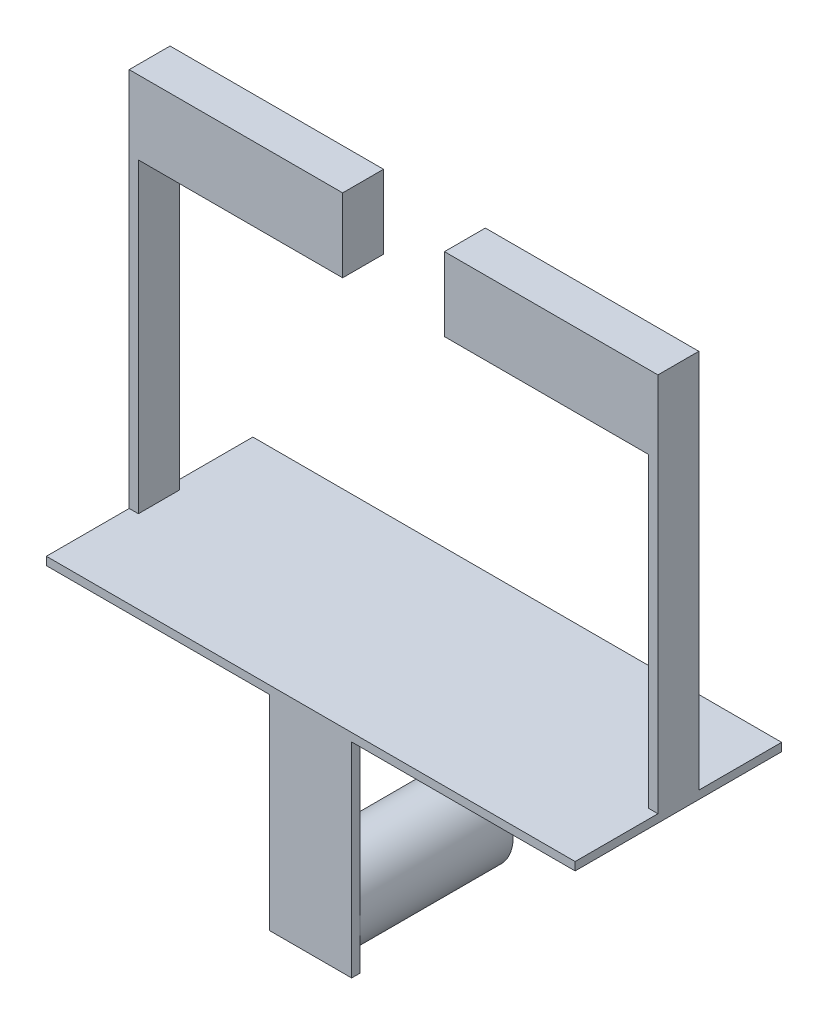
ISO-10303-21;
HEADER;
FILE_DESCRIPTION(('STEP AP214'),'2;1');
FILE_NAME('part.step','',(''),(''),'','','');
FILE_SCHEMA(('AUTOMOTIVE_DESIGN { 1 0 10303 214 1 1 1 1 }'));
ENDSEC;
DATA;
#1=APPLICATION_CONTEXT('core data for automotive mechanical design processes');
#2=APPLICATION_PROTOCOL_DEFINITION('international standard','automotive_design',2000,#1);
#3=PRODUCT_CONTEXT('',#1,'mechanical');
#4=PRODUCT('Part','Part','',(#3));
#5=PRODUCT_RELATED_PRODUCT_CATEGORY('part','',(#4));
#6=PRODUCT_DEFINITION_FORMATION('','',#4);
#7=PRODUCT_DEFINITION_CONTEXT('part definition',#1,'design');
#8=PRODUCT_DEFINITION('design','',#6,#7);
#9=PRODUCT_DEFINITION_SHAPE('','',#8);
#10=(LENGTH_UNIT() NAMED_UNIT(*) SI_UNIT(.MILLI.,.METRE.));
#11=(NAMED_UNIT(*) PLANE_ANGLE_UNIT() SI_UNIT($,.RADIAN.));
#12=(NAMED_UNIT(*) SI_UNIT($,.STERADIAN.) SOLID_ANGLE_UNIT());
#13=UNCERTAINTY_MEASURE_WITH_UNIT(LENGTH_MEASURE(1.E-05),#10,'distance_accuracy_value','');
#14=(GEOMETRIC_REPRESENTATION_CONTEXT(3) GLOBAL_UNCERTAINTY_ASSIGNED_CONTEXT((#13)) GLOBAL_UNIT_ASSIGNED_CONTEXT((#10,
#11,#12)) REPRESENTATION_CONTEXT('',''));
#15=CARTESIAN_POINT('',(0.,0.,0.));
#16=DIRECTION('',(0.,0.,1.));
#17=DIRECTION('',(1.,0.,0.));
#18=AXIS2_PLACEMENT_3D('',#15,#16,#17);
#19=CARTESIAN_POINT('',(0.,26.416,0.));
#20=DIRECTION('',(0.,-1.,0.));
#21=DIRECTION('',(0.,0.,-1.));
#22=AXIS2_PLACEMENT_3D('',#19,#20,#21);
#23=PLANE('',#22);
#24=DIRECTION('',(1.,0.,0.));
#25=VECTOR('',#24,1.);
#26=CARTESIAN_POINT('',(-44.9980277605177,26.416,-17.9190480402712));
#27=LINE('',#26,#25);
#28=CARTESIAN_POINT('',(-44.9980277605177,26.416,-17.9190480402712));
#29=VERTEX_POINT('',#28);
#30=CARTESIAN_POINT('',(-43.8550277605177,26.416,-17.9190480402712));
#31=VERTEX_POINT('',#30);
#32=EDGE_CURVE('E309',#29,#31,#27,.T.);
#33=ORIENTED_EDGE('',*,*,#32,.F.);
#34=DIRECTION('',(0.,0.,1.));
#35=VECTOR('',#34,1.);
#36=CARTESIAN_POINT('',(-44.9980277605177,26.416,-7.63204804027117));
#37=LINE('',#36,#35);
#38=CARTESIAN_POINT('',(-44.9980277605177,26.416,-7.63204804027117));
#39=VERTEX_POINT('',#38);
#40=EDGE_CURVE('E230',#29,#39,#37,.T.);
#41=ORIENTED_EDGE('',*,*,#40,.T.);
#42=DIRECTION('',(1.,0.,0.));
#43=VECTOR('',#42,1.);
#44=CARTESIAN_POINT('',(-44.9980277605177,26.416,-7.63204804027117));
#45=LINE('',#44,#43);
#46=CARTESIAN_POINT('',(20.6965322394823,26.416,-7.63204804027119));
#47=VERTEX_POINT('',#46);
#48=EDGE_CURVE('E370',#39,#47,#45,.T.);
#49=ORIENTED_EDGE('',*,*,#48,.T.);
#50=DIRECTION('',(0.,0.,-1.));
#51=VECTOR('',#50,1.);
#52=CARTESIAN_POINT('',(20.6965322394823,26.416,-7.63204804027119));
#53=LINE('',#52,#51);
#54=CARTESIAN_POINT('',(20.6965322394823,26.416,-17.9190480402712));
#55=VERTEX_POINT('',#54);
#56=EDGE_CURVE('E357',#47,#55,#53,.T.);
#57=ORIENTED_EDGE('',*,*,#56,.T.);
#58=DIRECTION('',(1.,0.,0.));
#59=VECTOR('',#58,1.);
#60=CARTESIAN_POINT('',(20.6965322394823,26.416,-17.9190480402712));
#61=LINE('',#60,#59);
#62=CARTESIAN_POINT('',(19.5414560760783,26.416,-17.9190480402712));
#63=VERTEX_POINT('',#62);
#64=EDGE_CURVE('E344',#63,#55,#61,.T.);
#65=ORIENTED_EDGE('',*,*,#64,.F.);
#66=DIRECTION('',(0.,0.,1.));
#67=VECTOR('',#66,1.);
#68=CARTESIAN_POINT('',(19.5414560760783,26.416,-22.9990480402712));
#69=LINE('',#68,#67);
#70=CARTESIAN_POINT('',(19.5414560760783,26.416,-22.9990480402712));
#71=VERTEX_POINT('',#70);
#72=EDGE_CURVE('E350',#71,#63,#69,.T.);
#73=ORIENTED_EDGE('',*,*,#72,.F.);
#74=DIRECTION('',(-1.,0.,0.));
#75=VECTOR('',#74,1.);
#76=CARTESIAN_POINT('',(20.6965322394823,26.416,-22.9990480402712));
#77=LINE('',#76,#75);
#78=CARTESIAN_POINT('',(20.6965322394823,26.416,-22.9990480402712));
#79=VERTEX_POINT('',#78);
#80=EDGE_CURVE('E312',#79,#71,#77,.T.);
#81=ORIENTED_EDGE('',*,*,#80,.F.);
#82=CARTESIAN_POINT('',(20.6965322394823,26.416,-33.2860480402712));
#83=VERTEX_POINT('',#82);
#84=EDGE_CURVE('E363',#79,#83,#53,.T.);
#85=ORIENTED_EDGE('',*,*,#84,.T.);
#86=DIRECTION('',(-1.,0.,0.));
#87=VECTOR('',#86,1.);
#88=CARTESIAN_POINT('',(-44.9980277605177,26.416,-33.2860480402712));
#89=LINE('',#88,#87);
#90=CARTESIAN_POINT('',(-44.9980277605177,26.416,-33.2860480402712));
#91=VERTEX_POINT('',#90);
#92=EDGE_CURVE('E359',#83,#91,#89,.T.);
#93=ORIENTED_EDGE('',*,*,#92,.T.);
#94=CARTESIAN_POINT('',(-44.9980277605177,26.416,-22.9990480402712));
#95=VERTEX_POINT('',#94);
#96=EDGE_CURVE('E364',#91,#95,#37,.T.);
#97=ORIENTED_EDGE('',*,*,#96,.T.);
#98=DIRECTION('',(-1.,0.,0.));
#99=VECTOR('',#98,1.);
#100=CARTESIAN_POINT('',(-44.9980277605177,26.416,-22.9990480402712));
#101=LINE('',#100,#99);
#102=CARTESIAN_POINT('',(-43.8550277605177,26.416,-22.9990480402712));
#103=VERTEX_POINT('',#102);
#104=EDGE_CURVE('E95',#103,#95,#101,.T.);
#105=ORIENTED_EDGE('',*,*,#104,.F.);
#106=DIRECTION('',(0.,0.,-1.));
#107=VECTOR('',#106,1.);
#108=CARTESIAN_POINT('',(-43.8550277605177,26.416,-17.9190480402712));
#109=LINE('',#108,#107);
#110=EDGE_CURVE('E86',#31,#103,#109,.T.);
#111=ORIENTED_EDGE('',*,*,#110,.F.);
#112=EDGE_LOOP('',(#33,#41,#49,#57,#65,#73,#81,#85,#93,#97,#105,#111));
#113=FACE_BOUND('',#112,.T.);
#114=ADVANCED_FACE('F69',(#113),#23,.F.);
#115=CARTESIAN_POINT('',(-17.2688477605177,25.4,-8.64804804027118));
#116=DIRECTION('',(0.,0.,1.));
#117=DIRECTION('',(1.,0.,0.));
#118=AXIS2_PLACEMENT_3D('',#115,#116,#117);
#119=PLANE('',#118);
#120=DIRECTION('',(0.,-1.,0.));
#121=VECTOR('',#120,1.);
#122=CARTESIAN_POINT('',(-17.2688477605177,25.4,-8.64804804027118));
#123=LINE('',#122,#121);
#124=CARTESIAN_POINT('',(-17.2688477605177,5.098542,-8.64804804027118));
#125=VERTEX_POINT('',#124);
#126=CARTESIAN_POINT('',(-17.2688477605177,0.,-8.64804804027118));
#127=VERTEX_POINT('',#126);
#128=EDGE_CURVE('E438',#125,#127,#123,.T.);
#129=ORIENTED_EDGE('',*,*,#128,.F.);
#130=CARTESIAN_POINT('',(-12.1697977605177,5.098542,-8.64804804027118));
#131=DIRECTION('',(0.,0.,1.));
#132=DIRECTION('',(1.,0.,0.));
#133=AXIS2_PLACEMENT_3D('',#130,#131,#132);
#134=CIRCLE('',#133,5.09905);
#135=CARTESIAN_POINT('',(-12.241772594564,0.,-8.64804804027118));
#136=VERTEX_POINT('',#135);
#137=EDGE_CURVE('E12',#125,#136,#134,.T.);
#138=ORIENTED_EDGE('',*,*,#137,.T.);
#139=DIRECTION('',(-1.,0.,0.));
#140=VECTOR('',#139,1.);
#141=CARTESIAN_POINT('',(-17.2688477605177,0.,-8.64804804027118));
#142=LINE('',#141,#140);
#143=EDGE_CURVE('E73',#136,#127,#142,.T.);
#144=ORIENTED_EDGE('',*,*,#143,.T.);
#145=EDGE_LOOP('',(#129,#138,#144));
#146=FACE_BOUND('',#145,.T.);
#147=ADVANCED_FACE('F507',(#146),#119,.F.);
#148=DIRECTION('',(0.,-1.,0.));
#149=VECTOR('',#148,1.);
#150=CARTESIAN_POINT('',(-7.0707477605177,25.4,-8.64804804027118));
#151=LINE('',#150,#149);
#152=CARTESIAN_POINT('',(-7.0707477605177,25.4,-8.64804804027118));
#153=VERTEX_POINT('',#152);
#154=CARTESIAN_POINT('',(-7.0707477605177,5.098542,-8.64804804027118));
#155=VERTEX_POINT('',#154);
#156=EDGE_CURVE('E437',#153,#155,#151,.T.);
#157=ORIENTED_EDGE('',*,*,#156,.T.);
#158=EDGE_CURVE('E397',#155,#125,#134,.T.);
#159=ORIENTED_EDGE('',*,*,#158,.T.);
#160=CARTESIAN_POINT('',(-17.2688477605177,25.4,-8.64804804027118));
#161=VERTEX_POINT('',#160);
#162=EDGE_CURVE('E435',#161,#125,#123,.T.);
#163=ORIENTED_EDGE('',*,*,#162,.F.);
#164=DIRECTION('',(-1.,0.,0.));
#165=VECTOR('',#164,1.);
#166=CARTESIAN_POINT('',(-17.2688477605177,25.4,-8.64804804027118));
#167=LINE('',#166,#165);
#168=EDGE_CURVE('E476',#153,#161,#167,.T.);
#169=ORIENTED_EDGE('',*,*,#168,.F.);
#170=EDGE_LOOP('',(#157,#159,#163,#169));
#171=FACE_BOUND('',#170,.T.);
#172=ADVANCED_FACE('F508',(#171),#119,.F.);
#173=CARTESIAN_POINT('',(-17.2688477605177,25.4,-8.64804804027118));
#174=DIRECTION('',(1.,0.,0.));
#175=DIRECTION('',(0.,0.,-1.));
#176=AXIS2_PLACEMENT_3D('',#173,#174,#175);
#177=PLANE('',#176);
#178=DIRECTION('',(0.,0.,1.));
#179=VECTOR('',#178,1.);
#180=CARTESIAN_POINT('',(-17.2688477605177,0.,-8.64804804027118));
#181=LINE('',#180,#179);
#182=CARTESIAN_POINT('',(-17.2688477605177,0.,-7.63204804027118));
#183=VERTEX_POINT('',#182);
#184=EDGE_CURVE('E403',#127,#183,#181,.T.);
#185=ORIENTED_EDGE('',*,*,#184,.T.);
#186=DIRECTION('',(0.,-1.,0.));
#187=VECTOR('',#186,1.);
#188=CARTESIAN_POINT('',(-17.2688477605177,25.4,-7.63204804027118));
#189=LINE('',#188,#187);
#190=CARTESIAN_POINT('',(-17.2688477605177,25.4,-7.63204804027118));
#191=VERTEX_POINT('',#190);
#192=EDGE_CURVE('E416',#191,#183,#189,.T.);
#193=ORIENTED_EDGE('',*,*,#192,.F.);
#194=DIRECTION('',(0.,0.,1.));
#195=VECTOR('',#194,1.);
#196=CARTESIAN_POINT('',(-17.2688477605177,25.4,-8.64804804027118));
#197=LINE('',#196,#195);
#198=EDGE_CURVE('E424',#161,#191,#197,.T.);
#199=ORIENTED_EDGE('',*,*,#198,.F.);
#200=ORIENTED_EDGE('',*,*,#162,.T.);
#201=ORIENTED_EDGE('',*,*,#128,.T.);
#202=EDGE_LOOP('',(#185,#193,#199,#200,#201));
#203=FACE_BOUND('',#202,.T.);
#204=ADVANCED_FACE('F71',(#203),#177,.F.);
#205=CARTESIAN_POINT('',(-17.2688477605177,25.4,-7.63204804027118));
#206=DIRECTION('',(0.,0.,-1.));
#207=DIRECTION('',(-1.,0.,0.));
#208=AXIS2_PLACEMENT_3D('',#205,#206,#207);
#209=PLANE('',#208);
#210=DIRECTION('',(1.,0.,0.));
#211=VECTOR('',#210,1.);
#212=CARTESIAN_POINT('',(-17.2688477605177,0.,-7.63204804027118));
#213=LINE('',#212,#211);
#214=CARTESIAN_POINT('',(-7.0707477605177,0.,-7.63204804027118));
#215=VERTEX_POINT('',#214);
#216=EDGE_CURVE('E466',#183,#215,#213,.T.);
#217=ORIENTED_EDGE('',*,*,#216,.T.);
#218=DIRECTION('',(0.,-1.,0.));
#219=VECTOR('',#218,1.);
#220=CARTESIAN_POINT('',(-7.0707477605177,25.4,-7.63204804027118));
#221=LINE('',#220,#219);
#222=CARTESIAN_POINT('',(-7.0707477605177,25.4,-7.63204804027118));
#223=VERTEX_POINT('',#222);
#224=EDGE_CURVE('E442',#223,#215,#221,.T.);
#225=ORIENTED_EDGE('',*,*,#224,.F.);
#226=DIRECTION('',(1.,0.,0.));
#227=VECTOR('',#226,1.);
#228=CARTESIAN_POINT('',(-44.9980277605177,25.4,-7.63204804027117));
#229=LINE('',#228,#227);
#230=CARTESIAN_POINT('',(20.6965322394823,25.4,-7.63204804027119));
#231=VERTEX_POINT('',#230);
#232=EDGE_CURVE('E379',#223,#231,#229,.T.);
#233=ORIENTED_EDGE('',*,*,#232,.T.);
#234=DIRECTION('',(0.,-1.,0.));
#235=VECTOR('',#234,1.);
#236=CARTESIAN_POINT('',(20.6965322394823,26.416,-7.63204804027119));
#237=LINE('',#236,#235);
#238=EDGE_CURVE('E369',#47,#231,#237,.T.);
#239=ORIENTED_EDGE('',*,*,#238,.F.);
#240=ORIENTED_EDGE('',*,*,#48,.F.);
#241=DIRECTION('',(0.,-1.,0.));
#242=VECTOR('',#241,1.);
#243=CARTESIAN_POINT('',(-44.9980277605177,26.416,-7.63204804027117));
#244=LINE('',#243,#242);
#245=CARTESIAN_POINT('',(-44.9980277605177,25.4,-7.63204804027117));
#246=VERTEX_POINT('',#245);
#247=EDGE_CURVE('E389',#39,#246,#244,.T.);
#248=ORIENTED_EDGE('',*,*,#247,.T.);
#249=EDGE_CURVE('E382',#246,#191,#229,.T.);
#250=ORIENTED_EDGE('',*,*,#249,.T.);
#251=ORIENTED_EDGE('',*,*,#192,.T.);
#252=EDGE_LOOP('',(#217,#225,#233,#239,#240,#248,#250,#251));
#253=FACE_BOUND('',#252,.T.);
#254=ADVANCED_FACE('F512',(#253),#209,.F.);
#255=CARTESIAN_POINT('',(-7.0707477605177,25.4,-8.64804804027118));
#256=DIRECTION('',(-1.,0.,0.));
#257=DIRECTION('',(0.,0.,1.));
#258=AXIS2_PLACEMENT_3D('',#255,#256,#257);
#259=PLANE('',#258);
#260=DIRECTION('',(0.,0.,-1.));
#261=VECTOR('',#260,1.);
#262=CARTESIAN_POINT('',(-7.0707477605177,0.,-8.64804804027118));
#263=LINE('',#262,#261);
#264=CARTESIAN_POINT('',(-7.0707477605177,0.,-8.64804804027118));
#265=VERTEX_POINT('',#264);
#266=EDGE_CURVE('E427',#215,#265,#263,.T.);
#267=ORIENTED_EDGE('',*,*,#266,.T.);
#268=EDGE_CURVE('E440',#155,#265,#151,.T.);
#269=ORIENTED_EDGE('',*,*,#268,.F.);
#270=ORIENTED_EDGE('',*,*,#156,.F.);
#271=DIRECTION('',(0.,0.,-1.));
#272=VECTOR('',#271,1.);
#273=CARTESIAN_POINT('',(-7.0707477605177,25.4,-8.64804804027118));
#274=LINE('',#273,#272);
#275=EDGE_CURVE('E481',#223,#153,#274,.T.);
#276=ORIENTED_EDGE('',*,*,#275,.F.);
#277=ORIENTED_EDGE('',*,*,#224,.T.);
#278=EDGE_LOOP('',(#267,#269,#270,#276,#277));
#279=FACE_BOUND('',#278,.T.);
#280=ADVANCED_FACE('F462',(#279),#259,.F.);
#281=CARTESIAN_POINT('',(-12.0978229264714,0.,-8.64804804027118));
#282=VERTEX_POINT('',#281);
#283=EDGE_CURVE('E422',#265,#282,#142,.T.);
#284=ORIENTED_EDGE('',*,*,#283,.T.);
#285=EDGE_CURVE('E81',#282,#155,#134,.T.);
#286=ORIENTED_EDGE('',*,*,#285,.T.);
#287=ORIENTED_EDGE('',*,*,#268,.T.);
#288=EDGE_LOOP('',(#284,#286,#287));
#289=FACE_BOUND('',#288,.T.);
#290=ADVANCED_FACE('F459',(#289),#119,.F.);
#291=CARTESIAN_POINT('',(0.,0.,0.));
#292=DIRECTION('',(0.,1.,0.));
#293=DIRECTION('',(0.,0.,1.));
#294=AXIS2_PLACEMENT_3D('',#291,#292,#293);
#295=PLANE('',#294);
#296=ORIENTED_EDGE('',*,*,#184,.F.);
#297=ORIENTED_EDGE('',*,*,#143,.F.);
#298=CARTESIAN_POINT('',(-12.1697977605177,5.098542,-8.64804804027119));
#299=DIRECTION('',(0.,0.,-1.));
#300=DIRECTION('',(0.0141153418864927,-0.999900373599004,0.));
#301=AXIS2_PLACEMENT_3D('',#298,#299,#300);
#302=CIRCLE('',#301,5.09905);
#303=EDGE_CURVE('E428',#282,#136,#302,.T.);
#304=ORIENTED_EDGE('',*,*,#303,.F.);
#305=ORIENTED_EDGE('',*,*,#283,.F.);
#306=ORIENTED_EDGE('',*,*,#266,.F.);
#307=ORIENTED_EDGE('',*,*,#216,.F.);
#308=EDGE_LOOP('',(#296,#297,#304,#305,#306,#307));
#309=FACE_BOUND('',#308,.T.);
#310=ADVANCED_FACE('F453',(#309),#295,.F.);
#311=CARTESIAN_POINT('',(-12.1697977605177,5.098542,-27.6980480402712));
#312=DIRECTION('',(0.,0.,1.));
#313=DIRECTION('',(1.,0.,0.));
#314=AXIS2_PLACEMENT_3D('',#311,#312,#313);
#315=CYLINDRICAL_SURFACE('',#314,5.09905);
#316=CARTESIAN_POINT('',(-12.1697977605177,5.098542,-27.6980480402712));
#317=DIRECTION('',(0.,0.,1.));
#318=DIRECTION('',(1.,0.,0.));
#319=AXIS2_PLACEMENT_3D('',#316,#317,#318);
#320=CIRCLE('',#319,5.09905);
#321=CARTESIAN_POINT('',(-7.0707477605177,5.098542,-27.6980480402712));
#322=VERTEX_POINT('',#321);
#323=EDGE_CURVE('E402',#322,#322,#320,.T.);
#324=ORIENTED_EDGE('',*,*,#323,.T.);
#325=EDGE_LOOP('',(#324));
#326=FACE_BOUND('',#325,.T.);
#327=ORIENTED_EDGE('',*,*,#158,.F.);
#328=ORIENTED_EDGE('',*,*,#285,.F.);
#329=ORIENTED_EDGE('',*,*,#303,.T.);
#330=ORIENTED_EDGE('',*,*,#137,.F.);
#331=EDGE_LOOP('',(#327,#328,#329,#330));
#332=FACE_BOUND('',#331,.T.);
#333=ADVANCED_FACE('F493',(#326,#332),#315,.T.);
#334=CARTESIAN_POINT('',(-12.1697977605177,5.098542,-27.6980480402712));
#335=DIRECTION('',(0.,0.,1.));
#336=DIRECTION('',(1.,0.,0.));
#337=AXIS2_PLACEMENT_3D('',#334,#335,#336);
#338=PLANE('',#337);
#339=ORIENTED_EDGE('',*,*,#323,.F.);
#340=EDGE_LOOP('',(#339));
#341=FACE_BOUND('',#340,.T.);
#342=ADVANCED_FACE('F499',(#341),#338,.F.);
#343=CARTESIAN_POINT('',(20.6965322394823,26.416,-7.63204804027119));
#344=DIRECTION('',(-1.,0.,0.));
#345=DIRECTION('',(0.,0.,1.));
#346=AXIS2_PLACEMENT_3D('',#343,#344,#345);
#347=PLANE('',#346);
#348=DIRECTION('',(0.,0.,-1.));
#349=VECTOR('',#348,1.);
#350=CARTESIAN_POINT('',(20.6965322394823,25.4,-7.63204804027119));
#351=LINE('',#350,#349);
#352=CARTESIAN_POINT('',(20.6965322394823,25.4,-33.2860480402712));
#353=VERTEX_POINT('',#352);
#354=EDGE_CURVE('E328',#231,#353,#351,.T.);
#355=ORIENTED_EDGE('',*,*,#354,.T.);
#356=DIRECTION('',(0.,-1.,0.));
#357=VECTOR('',#356,1.);
#358=CARTESIAN_POINT('',(20.6965322394823,26.416,-33.2860480402712));
#359=LINE('',#358,#357);
#360=EDGE_CURVE('E399',#83,#353,#359,.T.);
#361=ORIENTED_EDGE('',*,*,#360,.F.);
#362=ORIENTED_EDGE('',*,*,#84,.F.);
#363=DIRECTION('',(0.,-1.,0.));
#364=VECTOR('',#363,1.);
#365=CARTESIAN_POINT('',(20.6965322394823,64.4906,-22.9990480402712));
#366=LINE('',#365,#364);
#367=CARTESIAN_POINT('',(20.6965322394823,73.6346,-22.9990480402712));
#368=VERTEX_POINT('',#367);
#369=EDGE_CURVE('E274',#368,#79,#366,.T.);
#370=ORIENTED_EDGE('',*,*,#369,.F.);
#371=DIRECTION('',(0.,0.,-1.));
#372=VECTOR('',#371,1.);
#373=CARTESIAN_POINT('',(20.6965322394823,73.6346,-17.9190480402712));
#374=LINE('',#373,#372);
#375=CARTESIAN_POINT('',(20.6965322394823,73.6346,-17.9190480402712));
#376=VERTEX_POINT('',#375);
#377=EDGE_CURVE('E288',#376,#368,#374,.T.);
#378=ORIENTED_EDGE('',*,*,#377,.F.);
#379=DIRECTION('',(0.,-1.,0.));
#380=VECTOR('',#379,1.);
#381=CARTESIAN_POINT('',(20.6965322394823,64.4906,-17.9190480402712));
#382=LINE('',#381,#380);
#383=EDGE_CURVE('E336',#376,#55,#382,.T.);
#384=ORIENTED_EDGE('',*,*,#383,.T.);
#385=ORIENTED_EDGE('',*,*,#56,.F.);
#386=ORIENTED_EDGE('',*,*,#238,.T.);
#387=EDGE_LOOP('',(#355,#361,#362,#370,#378,#384,#385,#386));
#388=FACE_BOUND('',#387,.T.);
#389=ADVANCED_FACE('F537',(#388),#347,.F.);
#390=CARTESIAN_POINT('',(-44.9980277605177,26.416,-33.2860480402712));
#391=DIRECTION('',(0.,0.,1.));
#392=DIRECTION('',(1.,0.,0.));
#393=AXIS2_PLACEMENT_3D('',#390,#391,#392);
#394=PLANE('',#393);
#395=DIRECTION('',(-1.,0.,0.));
#396=VECTOR('',#395,1.);
#397=CARTESIAN_POINT('',(-44.9980277605177,25.4,-33.2860480402712));
#398=LINE('',#397,#396);
#399=CARTESIAN_POINT('',(-44.9980277605177,25.4,-33.2860480402712));
#400=VERTEX_POINT('',#399);
#401=EDGE_CURVE('E372',#353,#400,#398,.T.);
#402=ORIENTED_EDGE('',*,*,#401,.T.);
#403=DIRECTION('',(0.,-1.,0.));
#404=VECTOR('',#403,1.);
#405=CARTESIAN_POINT('',(-44.9980277605177,26.416,-33.2860480402712));
#406=LINE('',#405,#404);
#407=EDGE_CURVE('E395',#91,#400,#406,.T.);
#408=ORIENTED_EDGE('',*,*,#407,.F.);
#409=ORIENTED_EDGE('',*,*,#92,.F.);
#410=ORIENTED_EDGE('',*,*,#360,.T.);
#411=EDGE_LOOP('',(#402,#408,#409,#410));
#412=FACE_BOUND('',#411,.T.);
#413=ADVANCED_FACE('F533',(#412),#394,.F.);
#414=CARTESIAN_POINT('',(-44.9980277605177,26.416,-7.63204804027117));
#415=DIRECTION('',(1.,0.,0.));
#416=DIRECTION('',(0.,0.,-1.));
#417=AXIS2_PLACEMENT_3D('',#414,#415,#416);
#418=PLANE('',#417);
#419=DIRECTION('',(0.,0.,1.));
#420=VECTOR('',#419,1.);
#421=CARTESIAN_POINT('',(-44.9980277605177,25.4,-7.63204804027117));
#422=LINE('',#421,#420);
#423=EDGE_CURVE('E380',#400,#246,#422,.T.);
#424=ORIENTED_EDGE('',*,*,#423,.T.);
#425=ORIENTED_EDGE('',*,*,#247,.F.);
#426=ORIENTED_EDGE('',*,*,#40,.F.);
#427=DIRECTION('',(0.,-1.,0.));
#428=VECTOR('',#427,1.);
#429=CARTESIAN_POINT('',(-44.9980277605177,64.4906,-17.9190480402712));
#430=LINE('',#429,#428);
#431=CARTESIAN_POINT('',(-44.9980277605177,73.6346,-17.9190480402712));
#432=VERTEX_POINT('',#431);
#433=EDGE_CURVE('E221',#432,#29,#430,.T.);
#434=ORIENTED_EDGE('',*,*,#433,.F.);
#435=DIRECTION('',(0.,0.,1.));
#436=VECTOR('',#435,1.);
#437=CARTESIAN_POINT('',(-44.9980277605177,73.6346,-22.9990480402712));
#438=LINE('',#437,#436);
#439=CARTESIAN_POINT('',(-44.9980277605177,73.6346,-22.9990480402712));
#440=VERTEX_POINT('',#439);
#441=EDGE_CURVE('E227',#440,#432,#438,.T.);
#442=ORIENTED_EDGE('',*,*,#441,.F.);
#443=DIRECTION('',(0.,-1.,0.));
#444=VECTOR('',#443,1.);
#445=CARTESIAN_POINT('',(-44.9980277605177,64.4906,-22.9990480402712));
#446=LINE('',#445,#444);
#447=EDGE_CURVE('E235',#440,#95,#446,.T.);
#448=ORIENTED_EDGE('',*,*,#447,.T.);
#449=ORIENTED_EDGE('',*,*,#96,.F.);
#450=ORIENTED_EDGE('',*,*,#407,.T.);
#451=EDGE_LOOP('',(#424,#425,#426,#434,#442,#448,#449,#450));
#452=FACE_BOUND('',#451,.T.);
#453=ADVANCED_FACE('F223',(#452),#418,.F.);
#454=CARTESIAN_POINT('',(0.,25.4,0.));
#455=DIRECTION('',(0.,-1.,0.));
#456=DIRECTION('',(0.,0.,-1.));
#457=AXIS2_PLACEMENT_3D('',#454,#455,#456);
#458=PLANE('',#457);
#459=ORIENTED_EDGE('',*,*,#168,.T.);
#460=ORIENTED_EDGE('',*,*,#198,.T.);
#461=ORIENTED_EDGE('',*,*,#249,.F.);
#462=ORIENTED_EDGE('',*,*,#423,.F.);
#463=ORIENTED_EDGE('',*,*,#401,.F.);
#464=ORIENTED_EDGE('',*,*,#354,.F.);
#465=ORIENTED_EDGE('',*,*,#232,.F.);
#466=ORIENTED_EDGE('',*,*,#275,.T.);
#467=EDGE_LOOP('',(#459,#460,#461,#462,#463,#464,#465,#466));
#468=FACE_BOUND('',#467,.T.);
#469=ADVANCED_FACE('F528',(#468),#458,.T.);
#470=CARTESIAN_POINT('',(20.6965322394823,64.4906,-22.9990480402712));
#471=DIRECTION('',(0.,0.,1.));
#472=DIRECTION('',(1.,0.,0.));
#473=AXIS2_PLACEMENT_3D('',#470,#471,#472);
#474=PLANE('',#473);
#475=ORIENTED_EDGE('',*,*,#80,.T.);
#476=DIRECTION('',(0.,-1.,0.));
#477=VECTOR('',#476,1.);
#478=CARTESIAN_POINT('',(19.5414560760783,64.4906,-22.9990480402712));
#479=LINE('',#478,#477);
#480=CARTESIAN_POINT('',(19.5414560760783,64.4906,-22.9990480402712));
#481=VERTEX_POINT('',#480);
#482=EDGE_CURVE('E329',#481,#71,#479,.T.);
#483=ORIENTED_EDGE('',*,*,#482,.F.);
#484=DIRECTION('',(-1.,0.,0.));
#485=VECTOR('',#484,1.);
#486=CARTESIAN_POINT('',(20.6965322394823,64.4906,-22.9990480402712));
#487=LINE('',#486,#485);
#488=CARTESIAN_POINT('',(-5.8261477605177,64.4906,-22.9990480402712));
#489=VERTEX_POINT('',#488);
#490=EDGE_CURVE('E269',#481,#489,#487,.T.);
#491=ORIENTED_EDGE('',*,*,#490,.T.);
#492=DIRECTION('',(0.,-1.,0.));
#493=VECTOR('',#492,1.);
#494=CARTESIAN_POINT('',(-5.8261477605177,73.6346,-22.9990480402712));
#495=LINE('',#494,#493);
#496=CARTESIAN_POINT('',(-5.8261477605177,73.6346,-22.9990480402712));
#497=VERTEX_POINT('',#496);
#498=EDGE_CURVE('E273',#497,#489,#495,.T.);
#499=ORIENTED_EDGE('',*,*,#498,.F.);
#500=DIRECTION('',(-1.,0.,0.));
#501=VECTOR('',#500,1.);
#502=CARTESIAN_POINT('',(20.6965322394823,73.6346,-22.9990480402712));
#503=LINE('',#502,#501);
#504=EDGE_CURVE('E297',#368,#497,#503,.T.);
#505=ORIENTED_EDGE('',*,*,#504,.F.);
#506=ORIENTED_EDGE('',*,*,#369,.T.);
#507=EDGE_LOOP('',(#475,#483,#491,#499,#505,#506));
#508=FACE_BOUND('',#507,.T.);
#509=ADVANCED_FACE('F532',(#508),#474,.F.);
#510=CARTESIAN_POINT('',(19.5414560760783,64.4906,-22.9990480402712));
#511=DIRECTION('',(1.,0.,0.));
#512=DIRECTION('',(0.,0.,-1.));
#513=AXIS2_PLACEMENT_3D('',#510,#511,#512);
#514=PLANE('',#513);
#515=ORIENTED_EDGE('',*,*,#72,.T.);
#516=DIRECTION('',(0.,-1.,0.));
#517=VECTOR('',#516,1.);
#518=CARTESIAN_POINT('',(19.5414560760783,64.4906,-17.9190480402712));
#519=LINE('',#518,#517);
#520=CARTESIAN_POINT('',(19.5414560760783,64.4906,-17.9190480402712));
#521=VERTEX_POINT('',#520);
#522=EDGE_CURVE('E333',#521,#63,#519,.T.);
#523=ORIENTED_EDGE('',*,*,#522,.F.);
#524=DIRECTION('',(0.,0.,1.));
#525=VECTOR('',#524,1.);
#526=CARTESIAN_POINT('',(19.5414560760783,64.4906,-22.9990480402712));
#527=LINE('',#526,#525);
#528=EDGE_CURVE('E342',#481,#521,#527,.T.);
#529=ORIENTED_EDGE('',*,*,#528,.F.);
#530=ORIENTED_EDGE('',*,*,#482,.T.);
#531=EDGE_LOOP('',(#515,#523,#529,#530));
#532=FACE_BOUND('',#531,.T.);
#533=ADVANCED_FACE('F778',(#532),#514,.F.);
#534=CARTESIAN_POINT('',(20.6965322394823,64.4906,-17.9190480402712));
#535=DIRECTION('',(0.,0.,-1.));
#536=DIRECTION('',(-1.,0.,0.));
#537=AXIS2_PLACEMENT_3D('',#534,#535,#536);
#538=PLANE('',#537);
#539=ORIENTED_EDGE('',*,*,#64,.T.);
#540=ORIENTED_EDGE('',*,*,#383,.F.);
#541=DIRECTION('',(1.,0.,0.));
#542=VECTOR('',#541,1.);
#543=CARTESIAN_POINT('',(20.6965322394823,73.6346,-17.9190480402712));
#544=LINE('',#543,#542);
#545=CARTESIAN_POINT('',(-5.8261477605177,73.6346,-17.9190480402712));
#546=VERTEX_POINT('',#545);
#547=EDGE_CURVE('E281',#546,#376,#544,.T.);
#548=ORIENTED_EDGE('',*,*,#547,.F.);
#549=DIRECTION('',(0.,-1.,0.));
#550=VECTOR('',#549,1.);
#551=CARTESIAN_POINT('',(-5.8261477605177,73.6346,-17.9190480402712));
#552=LINE('',#551,#550);
#553=CARTESIAN_POINT('',(-5.8261477605177,64.4906,-17.9190480402712));
#554=VERTEX_POINT('',#553);
#555=EDGE_CURVE('E278',#546,#554,#552,.T.);
#556=ORIENTED_EDGE('',*,*,#555,.T.);
#557=DIRECTION('',(1.,0.,0.));
#558=VECTOR('',#557,1.);
#559=CARTESIAN_POINT('',(20.6965322394823,64.4906,-17.9190480402712));
#560=LINE('',#559,#558);
#561=EDGE_CURVE('E282',#554,#521,#560,.T.);
#562=ORIENTED_EDGE('',*,*,#561,.T.);
#563=ORIENTED_EDGE('',*,*,#522,.T.);
#564=EDGE_LOOP('',(#539,#540,#548,#556,#562,#563));
#565=FACE_BOUND('',#564,.T.);
#566=ADVANCED_FACE('F526',(#565),#538,.F.);
#567=CARTESIAN_POINT('',(-43.8550277605177,64.4906,-17.9190480402712));
#568=DIRECTION('',(-1.,0.,0.));
#569=DIRECTION('',(0.,0.,1.));
#570=AXIS2_PLACEMENT_3D('',#567,#568,#569);
#571=PLANE('',#570);
#572=ORIENTED_EDGE('',*,*,#110,.T.);
#573=DIRECTION('',(0.,-1.,0.));
#574=VECTOR('',#573,1.);
#575=CARTESIAN_POINT('',(-43.8550277605177,64.4906,-22.9990480402712));
#576=LINE('',#575,#574);
#577=CARTESIAN_POINT('',(-43.8550277605177,64.4906,-22.9990480402712));
#578=VERTEX_POINT('',#577);
#579=EDGE_CURVE('E324',#578,#103,#576,.T.);
#580=ORIENTED_EDGE('',*,*,#579,.F.);
#581=DIRECTION('',(0.,0.,-1.));
#582=VECTOR('',#581,1.);
#583=CARTESIAN_POINT('',(-43.8550277605177,64.4906,-17.9190480402712));
#584=LINE('',#583,#582);
#585=CARTESIAN_POINT('',(-43.8550277605177,64.4906,-17.9190480402712));
#586=VERTEX_POINT('',#585);
#587=EDGE_CURVE('E306',#586,#578,#584,.T.);
#588=ORIENTED_EDGE('',*,*,#587,.F.);
#589=DIRECTION('',(0.,-1.,0.));
#590=VECTOR('',#589,1.);
#591=CARTESIAN_POINT('',(-43.8550277605177,64.4906,-17.9190480402712));
#592=LINE('',#591,#590);
#593=EDGE_CURVE('E231',#586,#31,#592,.T.);
#594=ORIENTED_EDGE('',*,*,#593,.T.);
#595=EDGE_LOOP('',(#572,#580,#588,#594));
#596=FACE_BOUND('',#595,.T.);
#597=ADVANCED_FACE('F796',(#596),#571,.F.);
#598=CARTESIAN_POINT('',(-44.9980277605177,64.4906,-22.9990480402712));
#599=DIRECTION('',(0.,0.,1.));
#600=DIRECTION('',(1.,0.,0.));
#601=AXIS2_PLACEMENT_3D('',#598,#599,#600);
#602=PLANE('',#601);
#603=ORIENTED_EDGE('',*,*,#104,.T.);
#604=ORIENTED_EDGE('',*,*,#447,.F.);
#605=DIRECTION('',(-1.,0.,0.));
#606=VECTOR('',#605,1.);
#607=CARTESIAN_POINT('',(-44.9980277605177,73.6346,-22.9990480402712));
#608=LINE('',#607,#606);
#609=CARTESIAN_POINT('',(-18.4753477605177,73.6346,-22.9990480402712));
#610=VERTEX_POINT('',#609);
#611=EDGE_CURVE('E247',#610,#440,#608,.T.);
#612=ORIENTED_EDGE('',*,*,#611,.F.);
#613=DIRECTION('',(0.,-1.,0.));
#614=VECTOR('',#613,1.);
#615=CARTESIAN_POINT('',(-18.4753477605177,73.6346,-22.9990480402712));
#616=LINE('',#615,#614);
#617=CARTESIAN_POINT('',(-18.4753477605177,64.4906,-22.9990480402712));
#618=VERTEX_POINT('',#617);
#619=EDGE_CURVE('E265',#610,#618,#616,.T.);
#620=ORIENTED_EDGE('',*,*,#619,.T.);
#621=DIRECTION('',(-1.,0.,0.));
#622=VECTOR('',#621,1.);
#623=CARTESIAN_POINT('',(-44.9980277605177,64.4906,-22.9990480402712));
#624=LINE('',#623,#622);
#625=EDGE_CURVE('E249',#618,#578,#624,.T.);
#626=ORIENTED_EDGE('',*,*,#625,.T.);
#627=ORIENTED_EDGE('',*,*,#579,.T.);
#628=EDGE_LOOP('',(#603,#604,#612,#620,#626,#627));
#629=FACE_BOUND('',#628,.T.);
#630=ADVANCED_FACE('F804',(#629),#602,.F.);
#631=CARTESIAN_POINT('',(-44.9980277605177,64.4906,-17.9190480402712));
#632=DIRECTION('',(0.,0.,-1.));
#633=DIRECTION('',(-1.,0.,0.));
#634=AXIS2_PLACEMENT_3D('',#631,#632,#633);
#635=PLANE('',#634);
#636=ORIENTED_EDGE('',*,*,#32,.T.);
#637=ORIENTED_EDGE('',*,*,#593,.F.);
#638=DIRECTION('',(1.,0.,0.));
#639=VECTOR('',#638,1.);
#640=CARTESIAN_POINT('',(-44.9980277605177,64.4906,-17.9190480402712));
#641=LINE('',#640,#639);
#642=CARTESIAN_POINT('',(-18.4753477605177,64.4906,-17.9190480402712));
#643=VERTEX_POINT('',#642);
#644=EDGE_CURVE('E261',#586,#643,#641,.T.);
#645=ORIENTED_EDGE('',*,*,#644,.T.);
#646=DIRECTION('',(0.,-1.,0.));
#647=VECTOR('',#646,1.);
#648=CARTESIAN_POINT('',(-18.4753477605177,73.6346,-17.9190480402712));
#649=LINE('',#648,#647);
#650=CARTESIAN_POINT('',(-18.4753477605177,73.6346,-17.9190480402712));
#651=VERTEX_POINT('',#650);
#652=EDGE_CURVE('E237',#651,#643,#649,.T.);
#653=ORIENTED_EDGE('',*,*,#652,.F.);
#654=DIRECTION('',(1.,0.,0.));
#655=VECTOR('',#654,1.);
#656=CARTESIAN_POINT('',(-44.9980277605177,73.6346,-17.9190480402712));
#657=LINE('',#656,#655);
#658=EDGE_CURVE('E236',#432,#651,#657,.T.);
#659=ORIENTED_EDGE('',*,*,#658,.F.);
#660=ORIENTED_EDGE('',*,*,#433,.T.);
#661=EDGE_LOOP('',(#636,#637,#645,#653,#659,#660));
#662=FACE_BOUND('',#661,.T.);
#663=ADVANCED_FACE('F240',(#662),#635,.F.);
#664=CARTESIAN_POINT('',(0.,64.4906,0.));
#665=DIRECTION('',(0.,1.,0.));
#666=DIRECTION('',(0.,0.,1.));
#667=AXIS2_PLACEMENT_3D('',#664,#665,#666);
#668=PLANE('',#667);
#669=ORIENTED_EDGE('',*,*,#644,.F.);
#670=ORIENTED_EDGE('',*,*,#587,.T.);
#671=ORIENTED_EDGE('',*,*,#625,.F.);
#672=DIRECTION('',(0.,0.,-1.));
#673=VECTOR('',#672,1.);
#674=CARTESIAN_POINT('',(-18.4753477605177,64.4906,-22.9990480402712));
#675=LINE('',#674,#673);
#676=EDGE_CURVE('E253',#643,#618,#675,.T.);
#677=ORIENTED_EDGE('',*,*,#676,.F.);
#678=EDGE_LOOP('',(#669,#670,#671,#677));
#679=FACE_BOUND('',#678,.T.);
#680=ADVANCED_FACE('F823',(#679),#668,.F.);
#681=CARTESIAN_POINT('',(-18.4753477605177,73.6346,-22.9990480402712));
#682=DIRECTION('',(-1.,0.,0.));
#683=DIRECTION('',(0.,0.,1.));
#684=AXIS2_PLACEMENT_3D('',#681,#682,#683);
#685=PLANE('',#684);
#686=ORIENTED_EDGE('',*,*,#676,.T.);
#687=ORIENTED_EDGE('',*,*,#619,.F.);
#688=DIRECTION('',(0.,0.,-1.));
#689=VECTOR('',#688,1.);
#690=CARTESIAN_POINT('',(-18.4753477605177,73.6346,-22.9990480402712));
#691=LINE('',#690,#689);
#692=EDGE_CURVE('E243',#651,#610,#691,.T.);
#693=ORIENTED_EDGE('',*,*,#692,.F.);
#694=ORIENTED_EDGE('',*,*,#652,.T.);
#695=EDGE_LOOP('',(#686,#687,#693,#694));
#696=FACE_BOUND('',#695,.T.);
#697=ADVANCED_FACE('F835',(#696),#685,.F.);
#698=CARTESIAN_POINT('',(0.,73.6346,0.));
#699=DIRECTION('',(0.,1.,0.));
#700=DIRECTION('',(0.,0.,1.));
#701=AXIS2_PLACEMENT_3D('',#698,#699,#700);
#702=PLANE('',#701);
#703=ORIENTED_EDGE('',*,*,#441,.T.);
#704=ORIENTED_EDGE('',*,*,#658,.T.);
#705=ORIENTED_EDGE('',*,*,#692,.T.);
#706=ORIENTED_EDGE('',*,*,#611,.T.);
#707=EDGE_LOOP('',(#703,#704,#705,#706));
#708=FACE_BOUND('',#707,.T.);
#709=ADVANCED_FACE('F246',(#708),#702,.T.);
#710=CARTESIAN_POINT('',(0.,64.4906,0.));
#711=DIRECTION('',(0.,1.,0.));
#712=DIRECTION('',(0.,0.,1.));
#713=AXIS2_PLACEMENT_3D('',#710,#711,#712);
#714=PLANE('',#713);
#715=ORIENTED_EDGE('',*,*,#490,.F.);
#716=ORIENTED_EDGE('',*,*,#528,.T.);
#717=ORIENTED_EDGE('',*,*,#561,.F.);
#718=DIRECTION('',(0.,0.,1.));
#719=VECTOR('',#718,1.);
#720=CARTESIAN_POINT('',(-5.8261477605177,64.4906,-17.9190480402712));
#721=LINE('',#720,#719);
#722=EDGE_CURVE('E290',#489,#554,#721,.T.);
#723=ORIENTED_EDGE('',*,*,#722,.F.);
#724=EDGE_LOOP('',(#715,#716,#717,#723));
#725=FACE_BOUND('',#724,.T.);
#726=ADVANCED_FACE('F847',(#725),#714,.F.);
#727=CARTESIAN_POINT('',(-5.8261477605177,73.6346,-17.9190480402712));
#728=DIRECTION('',(1.,0.,0.));
#729=DIRECTION('',(0.,0.,-1.));
#730=AXIS2_PLACEMENT_3D('',#727,#728,#729);
#731=PLANE('',#730);
#732=ORIENTED_EDGE('',*,*,#722,.T.);
#733=ORIENTED_EDGE('',*,*,#555,.F.);
#734=DIRECTION('',(0.,0.,1.));
#735=VECTOR('',#734,1.);
#736=CARTESIAN_POINT('',(-5.8261477605177,73.6346,-17.9190480402712));
#737=LINE('',#736,#735);
#738=EDGE_CURVE('E300',#497,#546,#737,.T.);
#739=ORIENTED_EDGE('',*,*,#738,.F.);
#740=ORIENTED_EDGE('',*,*,#498,.T.);
#741=EDGE_LOOP('',(#732,#733,#739,#740));
#742=FACE_BOUND('',#741,.T.);
#743=ADVANCED_FACE('F860',(#742),#731,.F.);
#744=CARTESIAN_POINT('',(0.,73.6346,0.));
#745=DIRECTION('',(0.,1.,0.));
#746=DIRECTION('',(0.,0.,1.));
#747=AXIS2_PLACEMENT_3D('',#744,#745,#746);
#748=PLANE('',#747);
#749=ORIENTED_EDGE('',*,*,#377,.T.);
#750=ORIENTED_EDGE('',*,*,#504,.T.);
#751=ORIENTED_EDGE('',*,*,#738,.T.);
#752=ORIENTED_EDGE('',*,*,#547,.T.);
#753=EDGE_LOOP('',(#749,#750,#751,#752));
#754=FACE_BOUND('',#753,.T.);
#755=ADVANCED_FACE('F868',(#754),#748,.T.);
#756=CLOSED_SHELL('',(#114,#147,#172,#204,#254,#280,#290,#310,#333,#342,#389,#413,#453,#469,
#509,#533,#566,#597,#630,#663,#680,#697,#709,#726,#743,#755));
#757=MANIFOLD_SOLID_BREP('B2',#756);
#758=ADVANCED_BREP_SHAPE_REPRESENTATION('',(#18,#757),#14);
#759=SHAPE_DEFINITION_REPRESENTATION(#9,#758);
ENDSEC;
END-ISO-10303-21;
